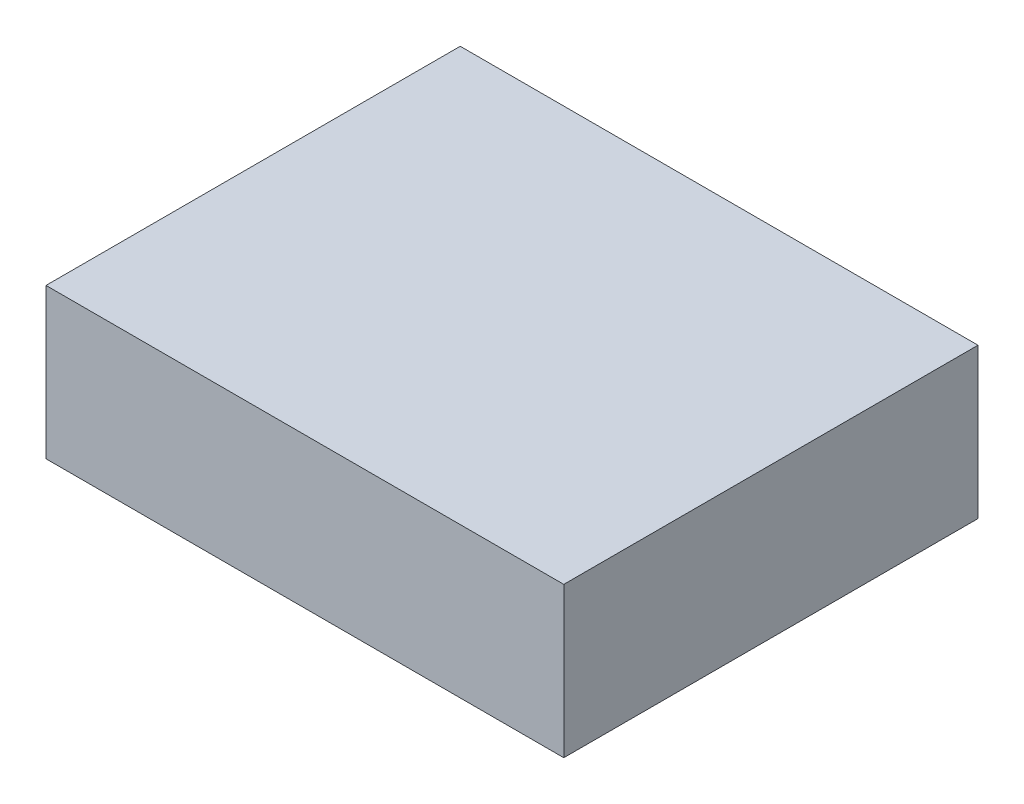
ISO-10303-21;
HEADER;
FILE_DESCRIPTION(('STEP AP214'),'2;1');
FILE_NAME('part.step','',(''),(''),'','','');
FILE_SCHEMA(('AUTOMOTIVE_DESIGN { 1 0 10303 214 1 1 1 1 }'));
ENDSEC;
DATA;
#1=APPLICATION_CONTEXT('core data for automotive mechanical design processes');
#2=APPLICATION_PROTOCOL_DEFINITION('international standard','automotive_design',2000,#1);
#3=PRODUCT_CONTEXT('',#1,'mechanical');
#4=PRODUCT('Part','Part','',(#3));
#5=PRODUCT_RELATED_PRODUCT_CATEGORY('part','',(#4));
#6=PRODUCT_DEFINITION_FORMATION('','',#4);
#7=PRODUCT_DEFINITION_CONTEXT('part definition',#1,'design');
#8=PRODUCT_DEFINITION('design','',#6,#7);
#9=PRODUCT_DEFINITION_SHAPE('','',#8);
#10=(LENGTH_UNIT() NAMED_UNIT(*) SI_UNIT(.MILLI.,.METRE.));
#11=(NAMED_UNIT(*) PLANE_ANGLE_UNIT() SI_UNIT($,.RADIAN.));
#12=(NAMED_UNIT(*) SI_UNIT($,.STERADIAN.) SOLID_ANGLE_UNIT());
#13=UNCERTAINTY_MEASURE_WITH_UNIT(LENGTH_MEASURE(1.E-05),#10,'distance_accuracy_value','');
#14=(GEOMETRIC_REPRESENTATION_CONTEXT(3) GLOBAL_UNCERTAINTY_ASSIGNED_CONTEXT((#13)) GLOBAL_UNIT_ASSIGNED_CONTEXT((#10,
#11,#12)) REPRESENTATION_CONTEXT('',''));
#15=CARTESIAN_POINT('',(0.,0.,0.));
#16=DIRECTION('',(0.,0.,1.));
#17=DIRECTION('',(1.,0.,0.));
#18=AXIS2_PLACEMENT_3D('',#15,#16,#17);
#19=CARTESIAN_POINT('',(50.,29.,-40.));
#20=DIRECTION('',(-1.,0.,0.));
#21=DIRECTION('',(0.,0.,1.));
#22=AXIS2_PLACEMENT_3D('',#19,#20,#21);
#23=PLANE('',#22);
#24=DIRECTION('',(0.,0.,-1.));
#25=VECTOR('',#24,1.);
#26=CARTESIAN_POINT('',(50.,0.,-40.));
#27=LINE('',#26,#25);
#28=CARTESIAN_POINT('',(50.,0.,40.));
#29=VERTEX_POINT('',#28);
#30=CARTESIAN_POINT('',(50.,0.,-40.));
#31=VERTEX_POINT('',#30);
#32=EDGE_CURVE('E96',#29,#31,#27,.T.);
#33=ORIENTED_EDGE('',*,*,#32,.T.);
#34=DIRECTION('',(0.,-1.,0.));
#35=VECTOR('',#34,1.);
#36=CARTESIAN_POINT('',(50.,29.,-40.));
#37=LINE('',#36,#35);
#38=CARTESIAN_POINT('',(50.,29.,-40.));
#39=VERTEX_POINT('',#38);
#40=EDGE_CURVE('E11',#39,#31,#37,.T.);
#41=ORIENTED_EDGE('',*,*,#40,.F.);
#42=DIRECTION('',(0.,0.,-1.));
#43=VECTOR('',#42,1.);
#44=CARTESIAN_POINT('',(50.,29.,-40.));
#45=LINE('',#44,#43);
#46=CARTESIAN_POINT('',(50.,29.,40.));
#47=VERTEX_POINT('',#46);
#48=EDGE_CURVE('E84',#47,#39,#45,.T.);
#49=ORIENTED_EDGE('',*,*,#48,.F.);
#50=DIRECTION('',(0.,-1.,0.));
#51=VECTOR('',#50,1.);
#52=CARTESIAN_POINT('',(50.,29.,40.));
#53=LINE('',#52,#51);
#54=EDGE_CURVE('E92',#47,#29,#53,.T.);
#55=ORIENTED_EDGE('',*,*,#54,.T.);
#56=EDGE_LOOP('',(#33,#41,#49,#55));
#57=FACE_BOUND('',#56,.T.);
#58=ADVANCED_FACE('F33',(#57),#23,.F.);
#59=CARTESIAN_POINT('',(-50.,29.,-40.));
#60=DIRECTION('',(0.,0.,1.));
#61=DIRECTION('',(1.,0.,0.));
#62=AXIS2_PLACEMENT_3D('',#59,#60,#61);
#63=PLANE('',#62);
#64=DIRECTION('',(-1.,0.,0.));
#65=VECTOR('',#64,1.);
#66=CARTESIAN_POINT('',(-50.,0.,-40.));
#67=LINE('',#66,#65);
#68=CARTESIAN_POINT('',(-50.,0.,-40.));
#69=VERTEX_POINT('',#68);
#70=EDGE_CURVE('E88',#31,#69,#67,.T.);
#71=ORIENTED_EDGE('',*,*,#70,.T.);
#72=DIRECTION('',(0.,-1.,0.));
#73=VECTOR('',#72,1.);
#74=CARTESIAN_POINT('',(-50.,29.,-40.));
#75=LINE('',#74,#73);
#76=CARTESIAN_POINT('',(-50.,29.,-40.));
#77=VERTEX_POINT('',#76);
#78=EDGE_CURVE('E41',#77,#69,#75,.T.);
#79=ORIENTED_EDGE('',*,*,#78,.F.);
#80=DIRECTION('',(-1.,0.,0.));
#81=VECTOR('',#80,1.);
#82=CARTESIAN_POINT('',(-50.,29.,-40.));
#83=LINE('',#82,#81);
#84=EDGE_CURVE('E79',#39,#77,#83,.T.);
#85=ORIENTED_EDGE('',*,*,#84,.F.);
#86=ORIENTED_EDGE('',*,*,#40,.T.);
#87=EDGE_LOOP('',(#71,#79,#85,#86));
#88=FACE_BOUND('',#87,.T.);
#89=ADVANCED_FACE('F87',(#88),#63,.F.);
#90=CARTESIAN_POINT('',(-50.,29.,-40.));
#91=DIRECTION('',(1.,0.,0.));
#92=DIRECTION('',(0.,0.,-1.));
#93=AXIS2_PLACEMENT_3D('',#90,#91,#92);
#94=PLANE('',#93);
#95=DIRECTION('',(0.,0.,1.));
#96=VECTOR('',#95,1.);
#97=CARTESIAN_POINT('',(-50.,0.,-40.));
#98=LINE('',#97,#96);
#99=CARTESIAN_POINT('',(-50.,0.,40.));
#100=VERTEX_POINT('',#99);
#101=EDGE_CURVE('E66',#69,#100,#98,.T.);
#102=ORIENTED_EDGE('',*,*,#101,.T.);
#103=DIRECTION('',(0.,-1.,0.));
#104=VECTOR('',#103,1.);
#105=CARTESIAN_POINT('',(-50.,29.,40.));
#106=LINE('',#105,#104);
#107=CARTESIAN_POINT('',(-50.,29.,40.));
#108=VERTEX_POINT('',#107);
#109=EDGE_CURVE('E89',#108,#100,#106,.T.);
#110=ORIENTED_EDGE('',*,*,#109,.F.);
#111=DIRECTION('',(0.,0.,1.));
#112=VECTOR('',#111,1.);
#113=CARTESIAN_POINT('',(-50.,29.,-40.));
#114=LINE('',#113,#112);
#115=EDGE_CURVE('E82',#77,#108,#114,.T.);
#116=ORIENTED_EDGE('',*,*,#115,.F.);
#117=ORIENTED_EDGE('',*,*,#78,.T.);
#118=EDGE_LOOP('',(#102,#110,#116,#117));
#119=FACE_BOUND('',#118,.T.);
#120=ADVANCED_FACE('F90',(#119),#94,.F.);
#121=CARTESIAN_POINT('',(-50.,29.,40.));
#122=DIRECTION('',(0.,0.,-1.));
#123=DIRECTION('',(-1.,0.,0.));
#124=AXIS2_PLACEMENT_3D('',#121,#122,#123);
#125=PLANE('',#124);
#126=DIRECTION('',(1.,0.,0.));
#127=VECTOR('',#126,1.);
#128=CARTESIAN_POINT('',(-50.,0.,40.));
#129=LINE('',#128,#127);
#130=EDGE_CURVE('E72',#100,#29,#129,.T.);
#131=ORIENTED_EDGE('',*,*,#130,.T.);
#132=ORIENTED_EDGE('',*,*,#54,.F.);
#133=DIRECTION('',(1.,0.,0.));
#134=VECTOR('',#133,1.);
#135=CARTESIAN_POINT('',(-50.,29.,40.));
#136=LINE('',#135,#134);
#137=EDGE_CURVE('E49',#108,#47,#136,.T.);
#138=ORIENTED_EDGE('',*,*,#137,.F.);
#139=ORIENTED_EDGE('',*,*,#109,.T.);
#140=EDGE_LOOP('',(#131,#132,#138,#139));
#141=FACE_BOUND('',#140,.T.);
#142=ADVANCED_FACE('F103',(#141),#125,.F.);
#143=CARTESIAN_POINT('',(0.,29.,0.));
#144=DIRECTION('',(0.,1.,0.));
#145=DIRECTION('',(0.,0.,1.));
#146=AXIS2_PLACEMENT_3D('',#143,#144,#145);
#147=PLANE('',#146);
#148=ORIENTED_EDGE('',*,*,#48,.T.);
#149=ORIENTED_EDGE('',*,*,#84,.T.);
#150=ORIENTED_EDGE('',*,*,#115,.T.);
#151=ORIENTED_EDGE('',*,*,#137,.T.);
#152=EDGE_LOOP('',(#148,#149,#150,#151));
#153=FACE_BOUND('',#152,.T.);
#154=ADVANCED_FACE('F80',(#153),#147,.T.);
#155=CARTESIAN_POINT('',(0.,0.,0.));
#156=DIRECTION('',(0.,1.,0.));
#157=DIRECTION('',(0.,0.,1.));
#158=AXIS2_PLACEMENT_3D('',#155,#156,#157);
#159=PLANE('',#158);
#160=ORIENTED_EDGE('',*,*,#32,.F.);
#161=ORIENTED_EDGE('',*,*,#130,.F.);
#162=ORIENTED_EDGE('',*,*,#101,.F.);
#163=ORIENTED_EDGE('',*,*,#70,.F.);
#164=EDGE_LOOP('',(#160,#161,#162,#163));
#165=FACE_BOUND('',#164,.T.);
#166=ADVANCED_FACE('F106',(#165),#159,.F.);
#167=CLOSED_SHELL('',(#58,#89,#120,#142,#154,#166));
#168=MANIFOLD_SOLID_BREP('B2',#167);
#169=ADVANCED_BREP_SHAPE_REPRESENTATION('',(#18,#168),#14);
#170=SHAPE_DEFINITION_REPRESENTATION(#9,#169);
ENDSEC;
END-ISO-10303-21;
